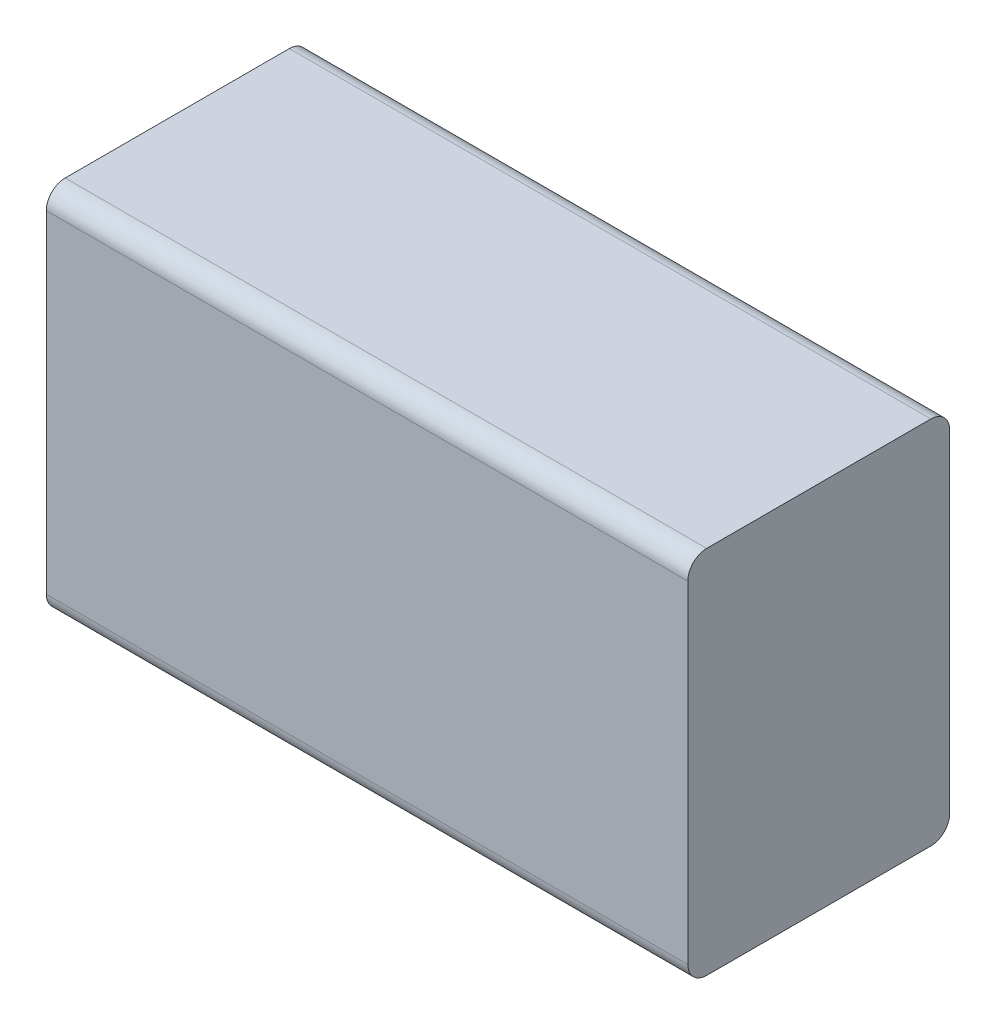
ISO-10303-21;
HEADER;
FILE_DESCRIPTION(('STEP AP214'),'2;1');
FILE_NAME('part.step','',(''),(''),'','','');
FILE_SCHEMA(('AUTOMOTIVE_DESIGN { 1 0 10303 214 1 1 1 1 }'));
ENDSEC;
DATA;
#1=APPLICATION_CONTEXT('core data for automotive mechanical design processes');
#2=APPLICATION_PROTOCOL_DEFINITION('international standard','automotive_design',2000,#1);
#3=PRODUCT_CONTEXT('',#1,'mechanical');
#4=PRODUCT('Part','Part','',(#3));
#5=PRODUCT_RELATED_PRODUCT_CATEGORY('part','',(#4));
#6=PRODUCT_DEFINITION_FORMATION('','',#4);
#7=PRODUCT_DEFINITION_CONTEXT('part definition',#1,'design');
#8=PRODUCT_DEFINITION('design','',#6,#7);
#9=PRODUCT_DEFINITION_SHAPE('','',#8);
#10=(LENGTH_UNIT() NAMED_UNIT(*) SI_UNIT(.MILLI.,.METRE.));
#11=(NAMED_UNIT(*) PLANE_ANGLE_UNIT() SI_UNIT($,.RADIAN.));
#12=(NAMED_UNIT(*) SI_UNIT($,.STERADIAN.) SOLID_ANGLE_UNIT());
#13=UNCERTAINTY_MEASURE_WITH_UNIT(LENGTH_MEASURE(1.E-05),#10,'distance_accuracy_value','');
#14=(GEOMETRIC_REPRESENTATION_CONTEXT(3) GLOBAL_UNCERTAINTY_ASSIGNED_CONTEXT((#13)) GLOBAL_UNIT_ASSIGNED_CONTEXT((#10,
#11,#12)) REPRESENTATION_CONTEXT('',''));
#15=CARTESIAN_POINT('',(0.,0.,0.));
#16=DIRECTION('',(0.,0.,1.));
#17=DIRECTION('',(1.,0.,0.));
#18=AXIS2_PLACEMENT_3D('',#15,#16,#17);
#19=CARTESIAN_POINT('',(0.,-0.22,0.3235));
#20=DIRECTION('',(-1.,0.,0.));
#21=DIRECTION('',(0.,0.,-1.));
#22=AXIS2_PLACEMENT_3D('',#19,#20,#21);
#23=CYLINDRICAL_SURFACE('',#22,0.025);
#24=CARTESIAN_POINT('',(0.425,-0.22,0.3235));
#25=DIRECTION('',(1.,0.,0.));
#26=DIRECTION('',(0.,0.,-1.));
#27=AXIS2_PLACEMENT_3D('',#24,#25,#26);
#28=CIRCLE('',#27,0.025);
#29=CARTESIAN_POINT('',(0.425,-0.22,0.3485));
#30=VERTEX_POINT('',#29);
#31=CARTESIAN_POINT('',(0.425,-0.245,0.3235));
#32=VERTEX_POINT('',#31);
#33=EDGE_CURVE('E42',#30,#32,#28,.T.);
#34=ORIENTED_EDGE('',*,*,#33,.F.);
#35=DIRECTION('',(1.,0.,0.));
#36=VECTOR('',#35,1.);
#37=CARTESIAN_POINT('',(0.425,-0.22,0.3485));
#38=LINE('',#37,#36);
#39=CARTESIAN_POINT('',(-0.425,-0.22,0.3485));
#40=VERTEX_POINT('',#39);
#41=EDGE_CURVE('E158',#40,#30,#38,.T.);
#42=ORIENTED_EDGE('',*,*,#41,.F.);
#43=CARTESIAN_POINT('',(-0.425,-0.22,0.3235));
#44=DIRECTION('',(-1.,0.,0.));
#45=DIRECTION('',(0.,0.,-1.));
#46=AXIS2_PLACEMENT_3D('',#43,#44,#45);
#47=CIRCLE('',#46,0.025);
#48=CARTESIAN_POINT('',(-0.425,-0.245,0.3235));
#49=VERTEX_POINT('',#48);
#50=EDGE_CURVE('E119',#49,#40,#47,.T.);
#51=ORIENTED_EDGE('',*,*,#50,.F.);
#52=DIRECTION('',(-1.,0.,0.));
#53=VECTOR('',#52,1.);
#54=CARTESIAN_POINT('',(-0.425,-0.245,0.3235));
#55=LINE('',#54,#53);
#56=EDGE_CURVE('E11',#32,#49,#55,.T.);
#57=ORIENTED_EDGE('',*,*,#56,.F.);
#58=EDGE_LOOP('',(#34,#42,#51,#57));
#59=FACE_BOUND('',#58,.T.);
#60=ADVANCED_FACE('F17',(#59),#23,.T.);
#61=CARTESIAN_POINT('',(0.,-0.22,0.0265));
#62=DIRECTION('',(1.,0.,0.));
#63=DIRECTION('',(0.,0.,1.));
#64=AXIS2_PLACEMENT_3D('',#61,#62,#63);
#65=CYLINDRICAL_SURFACE('',#64,0.025);
#66=CARTESIAN_POINT('',(0.425,-0.22,0.0265));
#67=DIRECTION('',(1.,0.,0.));
#68=DIRECTION('',(0.,0.,-1.));
#69=AXIS2_PLACEMENT_3D('',#66,#67,#68);
#70=CIRCLE('',#69,0.025);
#71=CARTESIAN_POINT('',(0.425,-0.245,0.0265));
#72=VERTEX_POINT('',#71);
#73=CARTESIAN_POINT('',(0.425,-0.22,0.00150000000000006));
#74=VERTEX_POINT('',#73);
#75=EDGE_CURVE('E128',#72,#74,#70,.T.);
#76=ORIENTED_EDGE('',*,*,#75,.F.);
#77=DIRECTION('',(1.,0.,0.));
#78=VECTOR('',#77,1.);
#79=CARTESIAN_POINT('',(0.,-0.245,0.0265));
#80=LINE('',#79,#78);
#81=CARTESIAN_POINT('',(-0.425,-0.245,0.0265));
#82=VERTEX_POINT('',#81);
#83=EDGE_CURVE('E126',#82,#72,#80,.T.);
#84=ORIENTED_EDGE('',*,*,#83,.F.);
#85=CARTESIAN_POINT('',(-0.425,-0.22,0.0265));
#86=DIRECTION('',(-1.,0.,0.));
#87=DIRECTION('',(0.,0.,-1.));
#88=AXIS2_PLACEMENT_3D('',#85,#86,#87);
#89=CIRCLE('',#88,0.025);
#90=CARTESIAN_POINT('',(-0.425,-0.22,0.00149999999999998));
#91=VERTEX_POINT('',#90);
#92=EDGE_CURVE('E168',#91,#82,#89,.T.);
#93=ORIENTED_EDGE('',*,*,#92,.F.);
#94=DIRECTION('',(-1.,0.,0.));
#95=VECTOR('',#94,1.);
#96=CARTESIAN_POINT('',(0.,-0.22,0.0015));
#97=LINE('',#96,#95);
#98=EDGE_CURVE('E181',#74,#91,#97,.T.);
#99=ORIENTED_EDGE('',*,*,#98,.F.);
#100=EDGE_LOOP('',(#76,#84,#93,#99));
#101=FACE_BOUND('',#100,.T.);
#102=ADVANCED_FACE('F211',(#101),#65,.T.);
#103=CARTESIAN_POINT('',(0.,0.22,0.3235));
#104=DIRECTION('',(-1.,0.,0.));
#105=DIRECTION('',(0.,0.,-1.));
#106=AXIS2_PLACEMENT_3D('',#103,#104,#105);
#107=CYLINDRICAL_SURFACE('',#106,0.025);
#108=CARTESIAN_POINT('',(0.425,0.22,0.3235));
#109=DIRECTION('',(1.,0.,0.));
#110=DIRECTION('',(0.,0.,-1.));
#111=AXIS2_PLACEMENT_3D('',#108,#109,#110);
#112=CIRCLE('',#111,0.025);
#113=CARTESIAN_POINT('',(0.425,0.245,0.3235));
#114=VERTEX_POINT('',#113);
#115=CARTESIAN_POINT('',(0.425,0.22,0.3485));
#116=VERTEX_POINT('',#115);
#117=EDGE_CURVE('E117',#114,#116,#112,.T.);
#118=ORIENTED_EDGE('',*,*,#117,.F.);
#119=DIRECTION('',(1.,0.,0.));
#120=VECTOR('',#119,1.);
#121=CARTESIAN_POINT('',(0.425,0.245,0.3235));
#122=LINE('',#121,#120);
#123=CARTESIAN_POINT('',(-0.425,0.245,0.3235));
#124=VERTEX_POINT('',#123);
#125=EDGE_CURVE('E137',#124,#114,#122,.T.);
#126=ORIENTED_EDGE('',*,*,#125,.F.);
#127=CARTESIAN_POINT('',(-0.425,0.22,0.3235));
#128=DIRECTION('',(-1.,0.,0.));
#129=DIRECTION('',(0.,0.,-1.));
#130=AXIS2_PLACEMENT_3D('',#127,#128,#129);
#131=CIRCLE('',#130,0.025);
#132=CARTESIAN_POINT('',(-0.425,0.22,0.3485));
#133=VERTEX_POINT('',#132);
#134=EDGE_CURVE('E175',#133,#124,#131,.T.);
#135=ORIENTED_EDGE('',*,*,#134,.F.);
#136=DIRECTION('',(-1.,0.,0.));
#137=VECTOR('',#136,1.);
#138=CARTESIAN_POINT('',(-0.425,0.22,0.3485));
#139=LINE('',#138,#137);
#140=EDGE_CURVE('E151',#116,#133,#139,.T.);
#141=ORIENTED_EDGE('',*,*,#140,.F.);
#142=EDGE_LOOP('',(#118,#126,#135,#141));
#143=FACE_BOUND('',#142,.T.);
#144=ADVANCED_FACE('F297',(#143),#107,.T.);
#145=CARTESIAN_POINT('',(0.,0.22,0.0265));
#146=DIRECTION('',(1.,0.,0.));
#147=DIRECTION('',(0.,0.,1.));
#148=AXIS2_PLACEMENT_3D('',#145,#146,#147);
#149=CYLINDRICAL_SURFACE('',#148,0.025);
#150=CARTESIAN_POINT('',(0.425,0.22,0.0265));
#151=DIRECTION('',(1.,0.,0.));
#152=DIRECTION('',(0.,0.,-1.));
#153=AXIS2_PLACEMENT_3D('',#150,#151,#152);
#154=CIRCLE('',#153,0.025);
#155=CARTESIAN_POINT('',(0.425,0.22,0.00150000000000006));
#156=VERTEX_POINT('',#155);
#157=CARTESIAN_POINT('',(0.425,0.245,0.0265));
#158=VERTEX_POINT('',#157);
#159=EDGE_CURVE('E73',#156,#158,#154,.T.);
#160=ORIENTED_EDGE('',*,*,#159,.F.);
#161=DIRECTION('',(1.,0.,0.));
#162=VECTOR('',#161,1.);
#163=CARTESIAN_POINT('',(0.,0.22,0.0015));
#164=LINE('',#163,#162);
#165=CARTESIAN_POINT('',(-0.425,0.22,0.00149999999999998));
#166=VERTEX_POINT('',#165);
#167=EDGE_CURVE('E184',#166,#156,#164,.T.);
#168=ORIENTED_EDGE('',*,*,#167,.F.);
#169=CARTESIAN_POINT('',(-0.425,0.22,0.0265));
#170=DIRECTION('',(-1.,0.,0.));
#171=DIRECTION('',(0.,0.,-1.));
#172=AXIS2_PLACEMENT_3D('',#169,#170,#171);
#173=CIRCLE('',#172,0.025);
#174=CARTESIAN_POINT('',(-0.425,0.245,0.0265));
#175=VERTEX_POINT('',#174);
#176=EDGE_CURVE('E82',#175,#166,#173,.T.);
#177=ORIENTED_EDGE('',*,*,#176,.F.);
#178=DIRECTION('',(-1.,0.,0.));
#179=VECTOR('',#178,1.);
#180=CARTESIAN_POINT('',(0.,0.245,0.0265));
#181=LINE('',#180,#179);
#182=EDGE_CURVE('E140',#158,#175,#181,.T.);
#183=ORIENTED_EDGE('',*,*,#182,.F.);
#184=EDGE_LOOP('',(#160,#168,#177,#183));
#185=FACE_BOUND('',#184,.T.);
#186=ADVANCED_FACE('F301',(#185),#149,.T.);
#187=CARTESIAN_POINT('',(0.,-0.245,0.175));
#188=DIRECTION('',(0.,-1.,0.));
#189=DIRECTION('',(0.,0.,-1.));
#190=AXIS2_PLACEMENT_3D('',#187,#188,#189);
#191=PLANE('',#190);
#192=DIRECTION('',(0.,0.,-1.));
#193=VECTOR('',#192,1.);
#194=CARTESIAN_POINT('',(0.425,-0.245,0.175));
#195=LINE('',#194,#193);
#196=EDGE_CURVE('E112',#32,#72,#195,.T.);
#197=ORIENTED_EDGE('',*,*,#196,.F.);
#198=ORIENTED_EDGE('',*,*,#56,.T.);
#199=DIRECTION('',(0.,0.,-1.));
#200=VECTOR('',#199,1.);
#201=CARTESIAN_POINT('',(-0.425,-0.245,0.175));
#202=LINE('',#201,#200);
#203=EDGE_CURVE('E28',#49,#82,#202,.T.);
#204=ORIENTED_EDGE('',*,*,#203,.T.);
#205=ORIENTED_EDGE('',*,*,#83,.T.);
#206=EDGE_LOOP('',(#197,#198,#204,#205));
#207=FACE_BOUND('',#206,.T.);
#208=ADVANCED_FACE('F124',(#207),#191,.T.);
#209=CARTESIAN_POINT('',(0.,0.245,0.175));
#210=DIRECTION('',(0.,1.,0.));
#211=DIRECTION('',(1.,0.,0.));
#212=AXIS2_PLACEMENT_3D('',#209,#210,#211);
#213=PLANE('',#212);
#214=DIRECTION('',(0.,0.,-1.));
#215=VECTOR('',#214,1.);
#216=CARTESIAN_POINT('',(0.425,0.245,0.175));
#217=LINE('',#216,#215);
#218=EDGE_CURVE('E149',#114,#158,#217,.T.);
#219=ORIENTED_EDGE('',*,*,#218,.T.);
#220=ORIENTED_EDGE('',*,*,#182,.T.);
#221=DIRECTION('',(0.,0.,-1.));
#222=VECTOR('',#221,1.);
#223=CARTESIAN_POINT('',(-0.425,0.245,0.175));
#224=LINE('',#223,#222);
#225=EDGE_CURVE('E134',#124,#175,#224,.T.);
#226=ORIENTED_EDGE('',*,*,#225,.F.);
#227=ORIENTED_EDGE('',*,*,#125,.T.);
#228=EDGE_LOOP('',(#219,#220,#226,#227));
#229=FACE_BOUND('',#228,.T.);
#230=ADVANCED_FACE('F19',(#229),#213,.T.);
#231=CARTESIAN_POINT('',(0.,-0.245,0.3485));
#232=DIRECTION('',(0.,0.,-1.));
#233=DIRECTION('',(0.,-1.,0.));
#234=AXIS2_PLACEMENT_3D('',#231,#232,#233);
#235=PLANE('',#234);
#236=DIRECTION('',(0.,1.,0.));
#237=VECTOR('',#236,1.);
#238=CARTESIAN_POINT('',(0.425,-0.245,0.3485));
#239=LINE('',#238,#237);
#240=EDGE_CURVE('E115',#30,#116,#239,.T.);
#241=ORIENTED_EDGE('',*,*,#240,.T.);
#242=ORIENTED_EDGE('',*,*,#140,.T.);
#243=DIRECTION('',(0.,1.,0.));
#244=VECTOR('',#243,1.);
#245=CARTESIAN_POINT('',(-0.425,-0.245,0.3485));
#246=LINE('',#245,#244);
#247=EDGE_CURVE('E21',#40,#133,#246,.T.);
#248=ORIENTED_EDGE('',*,*,#247,.F.);
#249=ORIENTED_EDGE('',*,*,#41,.T.);
#250=EDGE_LOOP('',(#241,#242,#248,#249));
#251=FACE_BOUND('',#250,.T.);
#252=ADVANCED_FACE('F214',(#251),#235,.F.);
#253=CARTESIAN_POINT('',(0.,-0.245,0.0015));
#254=DIRECTION('',(0.,0.,-1.));
#255=DIRECTION('',(0.,-1.,0.));
#256=AXIS2_PLACEMENT_3D('',#253,#254,#255);
#257=PLANE('',#256);
#258=DIRECTION('',(0.,1.,0.));
#259=VECTOR('',#258,1.);
#260=CARTESIAN_POINT('',(-0.425,-0.245,0.00149999999999998));
#261=LINE('',#260,#259);
#262=EDGE_CURVE('E180',#91,#166,#261,.T.);
#263=ORIENTED_EDGE('',*,*,#262,.T.);
#264=ORIENTED_EDGE('',*,*,#167,.T.);
#265=DIRECTION('',(0.,1.,0.));
#266=VECTOR('',#265,1.);
#267=CARTESIAN_POINT('',(0.425,-0.245,0.00150000000000006));
#268=LINE('',#267,#266);
#269=EDGE_CURVE('E185',#74,#156,#268,.T.);
#270=ORIENTED_EDGE('',*,*,#269,.F.);
#271=ORIENTED_EDGE('',*,*,#98,.T.);
#272=EDGE_LOOP('',(#263,#264,#270,#271));
#273=FACE_BOUND('',#272,.T.);
#274=ADVANCED_FACE('F202',(#273),#257,.T.);
#275=CARTESIAN_POINT('',(0.425,-0.245,0.175));
#276=DIRECTION('',(1.,0.,0.));
#277=DIRECTION('',(0.,0.,1.));
#278=AXIS2_PLACEMENT_3D('',#275,#276,#277);
#279=PLANE('',#278);
#280=ORIENTED_EDGE('',*,*,#269,.T.);
#281=ORIENTED_EDGE('',*,*,#159,.T.);
#282=ORIENTED_EDGE('',*,*,#218,.F.);
#283=ORIENTED_EDGE('',*,*,#117,.T.);
#284=ORIENTED_EDGE('',*,*,#240,.F.);
#285=ORIENTED_EDGE('',*,*,#33,.T.);
#286=ORIENTED_EDGE('',*,*,#196,.T.);
#287=ORIENTED_EDGE('',*,*,#75,.T.);
#288=EDGE_LOOP('',(#280,#281,#282,#283,#284,#285,#286,#287));
#289=FACE_BOUND('',#288,.T.);
#290=ADVANCED_FACE('F110',(#289),#279,.T.);
#291=CARTESIAN_POINT('',(-0.425,-0.245,0.175));
#292=DIRECTION('',(1.,0.,0.));
#293=DIRECTION('',(0.,0.,1.));
#294=AXIS2_PLACEMENT_3D('',#291,#292,#293);
#295=PLANE('',#294);
#296=ORIENTED_EDGE('',*,*,#225,.T.);
#297=ORIENTED_EDGE('',*,*,#176,.T.);
#298=ORIENTED_EDGE('',*,*,#262,.F.);
#299=ORIENTED_EDGE('',*,*,#92,.T.);
#300=ORIENTED_EDGE('',*,*,#203,.F.);
#301=ORIENTED_EDGE('',*,*,#50,.T.);
#302=ORIENTED_EDGE('',*,*,#247,.T.);
#303=ORIENTED_EDGE('',*,*,#134,.T.);
#304=EDGE_LOOP('',(#296,#297,#298,#299,#300,#301,#302,#303));
#305=FACE_BOUND('',#304,.T.);
#306=ADVANCED_FACE('F206',(#305),#295,.F.);
#307=CLOSED_SHELL('',(#60,#102,#144,#186,#208,#230,#252,#274,#290,#306));
#308=MANIFOLD_SOLID_BREP('B1',#307);
#309=ADVANCED_BREP_SHAPE_REPRESENTATION('',(#18,#308),#14);
#310=SHAPE_DEFINITION_REPRESENTATION(#9,#309);
ENDSEC;
END-ISO-10303-21;
